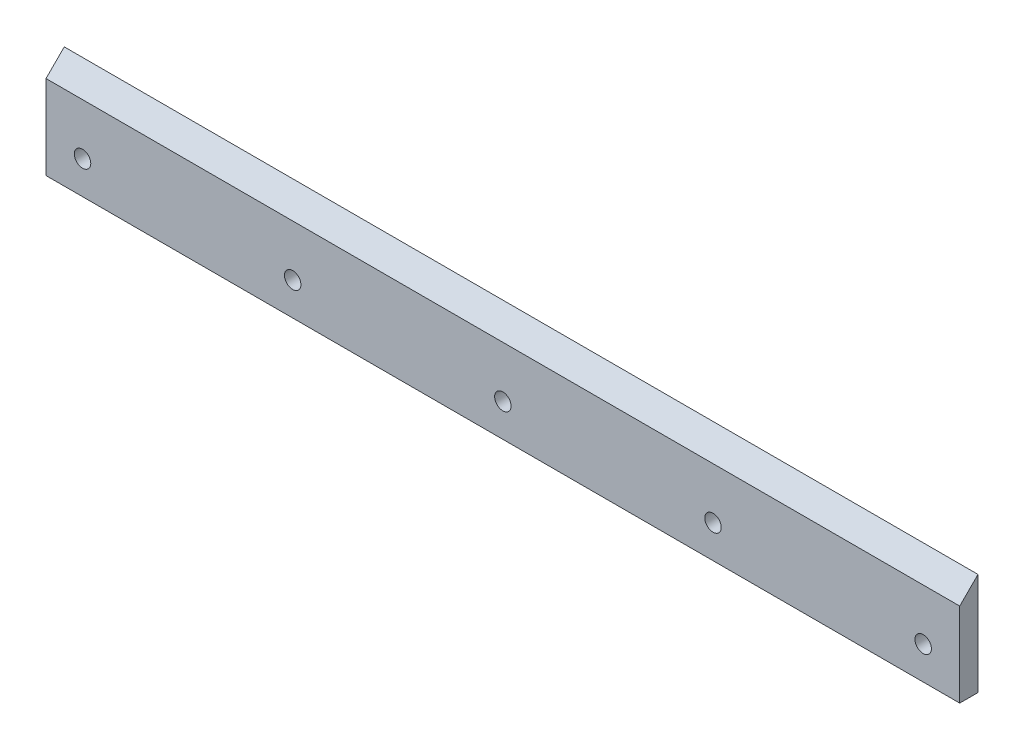
ISO-10303-21;
HEADER;
FILE_DESCRIPTION(('STEP AP214'),'2;1');
FILE_NAME('part.step','',(''),(''),'','','');
FILE_SCHEMA(('AUTOMOTIVE_DESIGN { 1 0 10303 214 1 1 1 1 }'));
ENDSEC;
DATA;
#1=APPLICATION_CONTEXT('core data for automotive mechanical design processes');
#2=APPLICATION_PROTOCOL_DEFINITION('international standard','automotive_design',2000,#1);
#3=PRODUCT_CONTEXT('',#1,'mechanical');
#4=PRODUCT('Part','Part','',(#3));
#5=PRODUCT_RELATED_PRODUCT_CATEGORY('part','',(#4));
#6=PRODUCT_DEFINITION_FORMATION('','',#4);
#7=PRODUCT_DEFINITION_CONTEXT('part definition',#1,'design');
#8=PRODUCT_DEFINITION('design','',#6,#7);
#9=PRODUCT_DEFINITION_SHAPE('','',#8);
#10=(LENGTH_UNIT() NAMED_UNIT(*) SI_UNIT(.MILLI.,.METRE.));
#11=(NAMED_UNIT(*) PLANE_ANGLE_UNIT() SI_UNIT($,.RADIAN.));
#12=(NAMED_UNIT(*) SI_UNIT($,.STERADIAN.) SOLID_ANGLE_UNIT());
#13=UNCERTAINTY_MEASURE_WITH_UNIT(LENGTH_MEASURE(1.E-05),#10,'distance_accuracy_value','');
#14=(GEOMETRIC_REPRESENTATION_CONTEXT(3) GLOBAL_UNCERTAINTY_ASSIGNED_CONTEXT((#13)) GLOBAL_UNIT_ASSIGNED_CONTEXT((#10,
#11,#12)) REPRESENTATION_CONTEXT('',''));
#15=CARTESIAN_POINT('',(0.,0.,0.));
#16=DIRECTION('',(0.,0.,1.));
#17=DIRECTION('',(1.,0.,0.));
#18=AXIS2_PLACEMENT_3D('',#15,#16,#17);
#19=CARTESIAN_POINT('',(250.,0.,5.));
#20=DIRECTION('',(0.,0.,-1.));
#21=DIRECTION('',(-1.,0.,0.));
#22=AXIS2_PLACEMENT_3D('',#19,#20,#21);
#23=PLANE('',#22);
#24=DIRECTION('',(0.,-1.,0.));
#25=VECTOR('',#24,1.);
#26=CARTESIAN_POINT('',(0.,0.,5.));
#27=LINE('',#26,#25);
#28=CARTESIAN_POINT('',(0.,23.,5.));
#29=VERTEX_POINT('',#28);
#30=CARTESIAN_POINT('',(0.,0.,5.));
#31=VERTEX_POINT('',#30);
#32=EDGE_CURVE('E66',#29,#31,#27,.T.);
#33=ORIENTED_EDGE('',*,*,#32,.T.);
#34=DIRECTION('',(-1.,0.,0.));
#35=VECTOR('',#34,1.);
#36=CARTESIAN_POINT('',(250.,0.,5.));
#37=LINE('',#36,#35);
#38=CARTESIAN_POINT('',(250.,0.,5.));
#39=VERTEX_POINT('',#38);
#40=EDGE_CURVE('E89',#39,#31,#37,.T.);
#41=ORIENTED_EDGE('',*,*,#40,.F.);
#42=DIRECTION('',(0.,-1.,0.));
#43=VECTOR('',#42,1.);
#44=CARTESIAN_POINT('',(250.,0.,5.));
#45=LINE('',#44,#43);
#46=CARTESIAN_POINT('',(250.,23.,5.));
#47=VERTEX_POINT('',#46);
#48=EDGE_CURVE('E82',#47,#39,#45,.T.);
#49=ORIENTED_EDGE('',*,*,#48,.F.);
#50=DIRECTION('',(-1.,0.,0.));
#51=VECTOR('',#50,1.);
#52=CARTESIAN_POINT('',(250.,23.,5.));
#53=LINE('',#52,#51);
#54=EDGE_CURVE('E41',#47,#29,#53,.T.);
#55=ORIENTED_EDGE('',*,*,#54,.T.);
#56=EDGE_LOOP('',(#33,#41,#49,#55));
#57=FACE_BOUND('',#56,.T.);
#58=CARTESIAN_POINT('',(10.,9.,5.));
#59=DIRECTION('',(0.,0.,1.));
#60=DIRECTION('',(1.,0.,0.));
#61=AXIS2_PLACEMENT_3D('',#58,#59,#60);
#62=CIRCLE('',#61,2.25);
#63=CARTESIAN_POINT('',(12.25,9.,5.));
#64=VERTEX_POINT('',#63);
#65=EDGE_CURVE('E112',#64,#64,#62,.T.);
#66=ORIENTED_EDGE('',*,*,#65,.F.);
#67=EDGE_LOOP('',(#66));
#68=FACE_BOUND('',#67,.T.);
#69=CARTESIAN_POINT('',(67.5,9.,5.));
#70=DIRECTION('',(0.,0.,1.));
#71=DIRECTION('',(1.,0.,0.));
#72=AXIS2_PLACEMENT_3D('',#69,#70,#71);
#73=CIRCLE('',#72,2.25);
#74=CARTESIAN_POINT('',(69.75,9.,5.));
#75=VERTEX_POINT('',#74);
#76=EDGE_CURVE('E118',#75,#75,#73,.T.);
#77=ORIENTED_EDGE('',*,*,#76,.F.);
#78=EDGE_LOOP('',(#77));
#79=FACE_BOUND('',#78,.T.);
#80=CARTESIAN_POINT('',(125.,9.,5.));
#81=DIRECTION('',(0.,0.,1.));
#82=DIRECTION('',(1.,0.,0.));
#83=AXIS2_PLACEMENT_3D('',#80,#81,#82);
#84=CIRCLE('',#83,2.25);
#85=CARTESIAN_POINT('',(127.25,9.,5.));
#86=VERTEX_POINT('',#85);
#87=EDGE_CURVE('E124',#86,#86,#84,.T.);
#88=ORIENTED_EDGE('',*,*,#87,.F.);
#89=EDGE_LOOP('',(#88));
#90=FACE_BOUND('',#89,.T.);
#91=CARTESIAN_POINT('',(182.5,9.,5.));
#92=DIRECTION('',(0.,0.,1.));
#93=DIRECTION('',(1.,0.,0.));
#94=AXIS2_PLACEMENT_3D('',#91,#92,#93);
#95=CIRCLE('',#94,2.25);
#96=CARTESIAN_POINT('',(184.75,9.,5.));
#97=VERTEX_POINT('',#96);
#98=EDGE_CURVE('E130',#97,#97,#95,.T.);
#99=ORIENTED_EDGE('',*,*,#98,.F.);
#100=EDGE_LOOP('',(#99));
#101=FACE_BOUND('',#100,.T.);
#102=CARTESIAN_POINT('',(240.,9.,5.));
#103=DIRECTION('',(0.,0.,1.));
#104=DIRECTION('',(1.,0.,0.));
#105=AXIS2_PLACEMENT_3D('',#102,#103,#104);
#106=CIRCLE('',#105,2.25);
#107=CARTESIAN_POINT('',(242.25,9.,5.));
#108=VERTEX_POINT('',#107);
#109=EDGE_CURVE('E136',#108,#108,#106,.T.);
#110=ORIENTED_EDGE('',*,*,#109,.F.);
#111=EDGE_LOOP('',(#110));
#112=FACE_BOUND('',#111,.T.);
#113=ADVANCED_FACE('F32',(#57,#68,#79,#90,#101,#112),#23,.F.);
#114=CARTESIAN_POINT('',(250.,0.,0.));
#115=DIRECTION('',(0.,0.,1.));
#116=DIRECTION('',(1.,0.,0.));
#117=AXIS2_PLACEMENT_3D('',#114,#115,#116);
#118=PLANE('',#117);
#119=CARTESIAN_POINT('',(240.,9.,0.));
#120=DIRECTION('',(0.,0.,1.));
#121=DIRECTION('',(1.,0.,0.));
#122=AXIS2_PLACEMENT_3D('',#119,#120,#121);
#123=CIRCLE('',#122,2.25);
#124=CARTESIAN_POINT('',(242.25,9.,0.));
#125=VERTEX_POINT('',#124);
#126=EDGE_CURVE('E133',#125,#125,#123,.T.);
#127=ORIENTED_EDGE('',*,*,#126,.T.);
#128=EDGE_LOOP('',(#127));
#129=FACE_BOUND('',#128,.T.);
#130=CARTESIAN_POINT('',(182.5,9.,0.));
#131=DIRECTION('',(0.,0.,1.));
#132=DIRECTION('',(1.,0.,0.));
#133=AXIS2_PLACEMENT_3D('',#130,#131,#132);
#134=CIRCLE('',#133,2.25);
#135=CARTESIAN_POINT('',(184.75,9.,0.));
#136=VERTEX_POINT('',#135);
#137=EDGE_CURVE('E127',#136,#136,#134,.T.);
#138=ORIENTED_EDGE('',*,*,#137,.T.);
#139=EDGE_LOOP('',(#138));
#140=FACE_BOUND('',#139,.T.);
#141=CARTESIAN_POINT('',(125.,9.,0.));
#142=DIRECTION('',(0.,0.,1.));
#143=DIRECTION('',(1.,0.,0.));
#144=AXIS2_PLACEMENT_3D('',#141,#142,#143);
#145=CIRCLE('',#144,2.25);
#146=CARTESIAN_POINT('',(127.25,9.,0.));
#147=VERTEX_POINT('',#146);
#148=EDGE_CURVE('E121',#147,#147,#145,.T.);
#149=ORIENTED_EDGE('',*,*,#148,.T.);
#150=EDGE_LOOP('',(#149));
#151=FACE_BOUND('',#150,.T.);
#152=CARTESIAN_POINT('',(67.5,9.,0.));
#153=DIRECTION('',(0.,0.,1.));
#154=DIRECTION('',(1.,0.,0.));
#155=AXIS2_PLACEMENT_3D('',#152,#153,#154);
#156=CIRCLE('',#155,2.25);
#157=CARTESIAN_POINT('',(69.75,9.,0.));
#158=VERTEX_POINT('',#157);
#159=EDGE_CURVE('E115',#158,#158,#156,.T.);
#160=ORIENTED_EDGE('',*,*,#159,.T.);
#161=EDGE_LOOP('',(#160));
#162=FACE_BOUND('',#161,.T.);
#163=CARTESIAN_POINT('',(10.,9.,0.));
#164=DIRECTION('',(0.,0.,1.));
#165=DIRECTION('',(1.,0.,0.));
#166=AXIS2_PLACEMENT_3D('',#163,#164,#165);
#167=CIRCLE('',#166,2.25);
#168=CARTESIAN_POINT('',(12.25,9.,0.));
#169=VERTEX_POINT('',#168);
#170=EDGE_CURVE('E99',#169,#169,#167,.T.);
#171=ORIENTED_EDGE('',*,*,#170,.T.);
#172=EDGE_LOOP('',(#171));
#173=FACE_BOUND('',#172,.T.);
#174=DIRECTION('',(0.,1.,0.));
#175=VECTOR('',#174,1.);
#176=CARTESIAN_POINT('',(0.,0.,0.));
#177=LINE('',#176,#175);
#178=CARTESIAN_POINT('',(0.,0.,0.));
#179=VERTEX_POINT('',#178);
#180=CARTESIAN_POINT('',(0.,28.,0.));
#181=VERTEX_POINT('',#180);
#182=EDGE_CURVE('E96',#179,#181,#177,.T.);
#183=ORIENTED_EDGE('',*,*,#182,.T.);
#184=DIRECTION('',(-1.,0.,0.));
#185=VECTOR('',#184,1.);
#186=CARTESIAN_POINT('',(250.,28.,0.));
#187=LINE('',#186,#185);
#188=CARTESIAN_POINT('',(250.,28.,0.));
#189=VERTEX_POINT('',#188);
#190=EDGE_CURVE('E11',#189,#181,#187,.T.);
#191=ORIENTED_EDGE('',*,*,#190,.F.);
#192=DIRECTION('',(0.,1.,0.));
#193=VECTOR('',#192,1.);
#194=CARTESIAN_POINT('',(250.,0.,0.));
#195=LINE('',#194,#193);
#196=CARTESIAN_POINT('',(250.,0.,0.));
#197=VERTEX_POINT('',#196);
#198=EDGE_CURVE('E84',#197,#189,#195,.T.);
#199=ORIENTED_EDGE('',*,*,#198,.F.);
#200=DIRECTION('',(-1.,0.,0.));
#201=VECTOR('',#200,1.);
#202=CARTESIAN_POINT('',(250.,0.,0.));
#203=LINE('',#202,#201);
#204=EDGE_CURVE('E92',#197,#179,#203,.T.);
#205=ORIENTED_EDGE('',*,*,#204,.T.);
#206=EDGE_LOOP('',(#183,#191,#199,#205));
#207=FACE_BOUND('',#206,.T.);
#208=ADVANCED_FACE('F34',(#129,#140,#151,#162,#173,#207),#118,.F.);
#209=CARTESIAN_POINT('',(250.,23.,5.));
#210=DIRECTION('',(0.,-0.707106781186548,-0.707106781186548));
#211=DIRECTION('',(0.,0.707106781186548,-0.707106781186548));
#212=AXIS2_PLACEMENT_3D('',#209,#210,#211);
#213=PLANE('',#212);
#214=DIRECTION('',(0.,-0.707106781186548,0.707106781186548));
#215=VECTOR('',#214,1.);
#216=CARTESIAN_POINT('',(0.,23.,5.));
#217=LINE('',#216,#215);
#218=EDGE_CURVE('E88',#181,#29,#217,.T.);
#219=ORIENTED_EDGE('',*,*,#218,.T.);
#220=ORIENTED_EDGE('',*,*,#54,.F.);
#221=DIRECTION('',(0.,-0.707106781186548,0.707106781186548));
#222=VECTOR('',#221,1.);
#223=CARTESIAN_POINT('',(250.,23.,5.));
#224=LINE('',#223,#222);
#225=EDGE_CURVE('E79',#189,#47,#224,.T.);
#226=ORIENTED_EDGE('',*,*,#225,.F.);
#227=ORIENTED_EDGE('',*,*,#190,.T.);
#228=EDGE_LOOP('',(#219,#220,#226,#227));
#229=FACE_BOUND('',#228,.T.);
#230=ADVANCED_FACE('F87',(#229),#213,.F.);
#231=CARTESIAN_POINT('',(250.,0.,0.));
#232=DIRECTION('',(0.,1.,0.));
#233=DIRECTION('',(0.,0.,1.));
#234=AXIS2_PLACEMENT_3D('',#231,#232,#233);
#235=PLANE('',#234);
#236=DIRECTION('',(0.,0.,-1.));
#237=VECTOR('',#236,1.);
#238=CARTESIAN_POINT('',(0.,0.,0.));
#239=LINE('',#238,#237);
#240=EDGE_CURVE('E72',#31,#179,#239,.T.);
#241=ORIENTED_EDGE('',*,*,#240,.T.);
#242=ORIENTED_EDGE('',*,*,#204,.F.);
#243=DIRECTION('',(0.,0.,-1.));
#244=VECTOR('',#243,1.);
#245=CARTESIAN_POINT('',(250.,0.,0.));
#246=LINE('',#245,#244);
#247=EDGE_CURVE('E49',#39,#197,#246,.T.);
#248=ORIENTED_EDGE('',*,*,#247,.F.);
#249=ORIENTED_EDGE('',*,*,#40,.T.);
#250=EDGE_LOOP('',(#241,#242,#248,#249));
#251=FACE_BOUND('',#250,.T.);
#252=ADVANCED_FACE('F104',(#251),#235,.F.);
#253=CARTESIAN_POINT('',(250.,0.,0.));
#254=DIRECTION('',(1.,0.,0.));
#255=DIRECTION('',(0.,0.,-1.));
#256=AXIS2_PLACEMENT_3D('',#253,#254,#255);
#257=PLANE('',#256);
#258=ORIENTED_EDGE('',*,*,#198,.T.);
#259=ORIENTED_EDGE('',*,*,#225,.T.);
#260=ORIENTED_EDGE('',*,*,#48,.T.);
#261=ORIENTED_EDGE('',*,*,#247,.T.);
#262=EDGE_LOOP('',(#258,#259,#260,#261));
#263=FACE_BOUND('',#262,.T.);
#264=ADVANCED_FACE('F80',(#263),#257,.T.);
#265=CARTESIAN_POINT('',(0.,0.,0.));
#266=DIRECTION('',(1.,0.,0.));
#267=DIRECTION('',(0.,0.,-1.));
#268=AXIS2_PLACEMENT_3D('',#265,#266,#267);
#269=PLANE('',#268);
#270=ORIENTED_EDGE('',*,*,#182,.F.);
#271=ORIENTED_EDGE('',*,*,#240,.F.);
#272=ORIENTED_EDGE('',*,*,#32,.F.);
#273=ORIENTED_EDGE('',*,*,#218,.F.);
#274=EDGE_LOOP('',(#270,#271,#272,#273));
#275=FACE_BOUND('',#274,.T.);
#276=ADVANCED_FACE('F107',(#275),#269,.F.);
#277=CARTESIAN_POINT('',(10.,9.,5.));
#278=DIRECTION('',(0.,0.,1.));
#279=DIRECTION('',(1.,0.,0.));
#280=AXIS2_PLACEMENT_3D('',#277,#278,#279);
#281=CYLINDRICAL_SURFACE('',#280,2.25);
#282=ORIENTED_EDGE('',*,*,#170,.F.);
#283=EDGE_LOOP('',(#282));
#284=FACE_BOUND('',#283,.T.);
#285=ORIENTED_EDGE('',*,*,#65,.T.);
#286=EDGE_LOOP('',(#285));
#287=FACE_BOUND('',#286,.T.);
#288=ADVANCED_FACE('F161',(#284,#287),#281,.F.);
#289=CARTESIAN_POINT('',(67.5,9.,5.));
#290=DIRECTION('',(0.,0.,1.));
#291=DIRECTION('',(1.,0.,0.));
#292=AXIS2_PLACEMENT_3D('',#289,#290,#291);
#293=CYLINDRICAL_SURFACE('',#292,2.25);
#294=ORIENTED_EDGE('',*,*,#159,.F.);
#295=EDGE_LOOP('',(#294));
#296=FACE_BOUND('',#295,.T.);
#297=ORIENTED_EDGE('',*,*,#76,.T.);
#298=EDGE_LOOP('',(#297));
#299=FACE_BOUND('',#298,.T.);
#300=ADVANCED_FACE('F165',(#296,#299),#293,.F.);
#301=CARTESIAN_POINT('',(125.,9.,5.));
#302=DIRECTION('',(0.,0.,1.));
#303=DIRECTION('',(1.,0.,0.));
#304=AXIS2_PLACEMENT_3D('',#301,#302,#303);
#305=CYLINDRICAL_SURFACE('',#304,2.25);
#306=ORIENTED_EDGE('',*,*,#148,.F.);
#307=EDGE_LOOP('',(#306));
#308=FACE_BOUND('',#307,.T.);
#309=ORIENTED_EDGE('',*,*,#87,.T.);
#310=EDGE_LOOP('',(#309));
#311=FACE_BOUND('',#310,.T.);
#312=ADVANCED_FACE('F169',(#308,#311),#305,.F.);
#313=CARTESIAN_POINT('',(182.5,9.,5.));
#314=DIRECTION('',(0.,0.,1.));
#315=DIRECTION('',(1.,0.,0.));
#316=AXIS2_PLACEMENT_3D('',#313,#314,#315);
#317=CYLINDRICAL_SURFACE('',#316,2.25);
#318=ORIENTED_EDGE('',*,*,#137,.F.);
#319=EDGE_LOOP('',(#318));
#320=FACE_BOUND('',#319,.T.);
#321=ORIENTED_EDGE('',*,*,#98,.T.);
#322=EDGE_LOOP('',(#321));
#323=FACE_BOUND('',#322,.T.);
#324=ADVANCED_FACE('F173',(#320,#323),#317,.F.);
#325=CARTESIAN_POINT('',(240.,9.,5.));
#326=DIRECTION('',(0.,0.,1.));
#327=DIRECTION('',(1.,0.,0.));
#328=AXIS2_PLACEMENT_3D('',#325,#326,#327);
#329=CYLINDRICAL_SURFACE('',#328,2.25);
#330=ORIENTED_EDGE('',*,*,#126,.F.);
#331=EDGE_LOOP('',(#330));
#332=FACE_BOUND('',#331,.T.);
#333=ORIENTED_EDGE('',*,*,#109,.T.);
#334=EDGE_LOOP('',(#333));
#335=FACE_BOUND('',#334,.T.);
#336=ADVANCED_FACE('F140',(#332,#335),#329,.F.);
#337=CLOSED_SHELL('',(#113,#208,#230,#252,#264,#276,#288,#300,#312,#324,#336));
#338=MANIFOLD_SOLID_BREP('B2',#337);
#339=ADVANCED_BREP_SHAPE_REPRESENTATION('',(#18,#338),#14);
#340=SHAPE_DEFINITION_REPRESENTATION(#9,#339);
ENDSEC;
END-ISO-10303-21;
